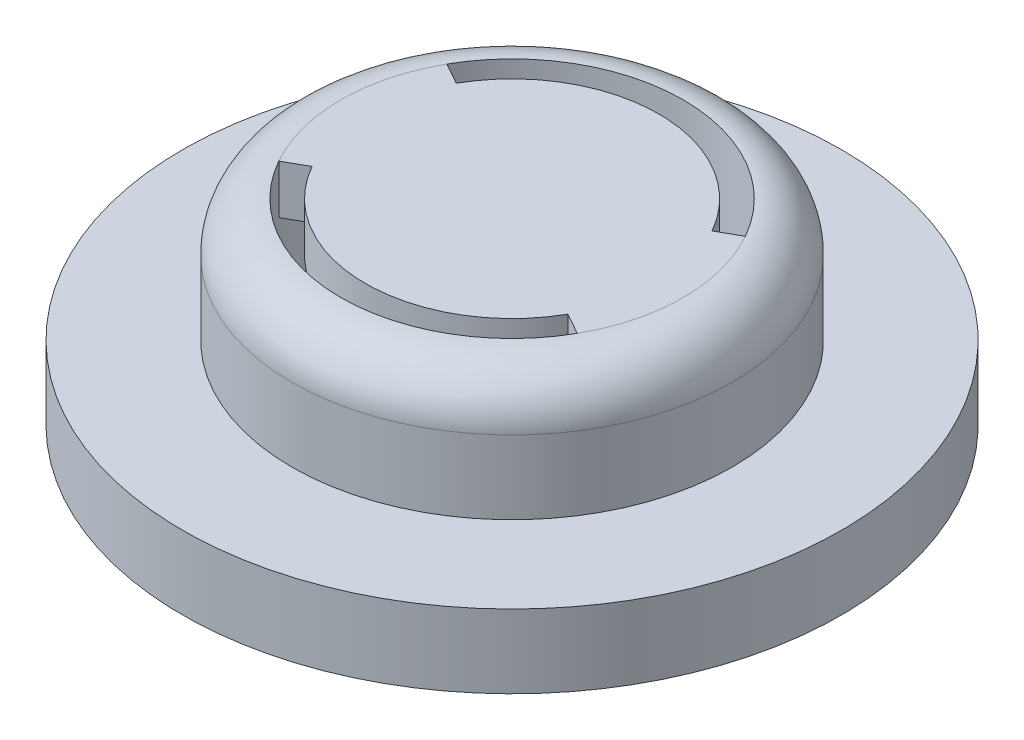
ISO-10303-21;
HEADER;
FILE_DESCRIPTION(('STEP AP214'),'2;1');
FILE_NAME('part.step','',(''),(''),'','','');
FILE_SCHEMA(('AUTOMOTIVE_DESIGN { 1 0 10303 214 1 1 1 1 }'));
ENDSEC;
DATA;
#1=APPLICATION_CONTEXT('core data for automotive mechanical design processes');
#2=APPLICATION_PROTOCOL_DEFINITION('international standard','automotive_design',2000,#1);
#3=PRODUCT_CONTEXT('',#1,'mechanical');
#4=PRODUCT('Part','Part','',(#3));
#5=PRODUCT_RELATED_PRODUCT_CATEGORY('part','',(#4));
#6=PRODUCT_DEFINITION_FORMATION('','',#4);
#7=PRODUCT_DEFINITION_CONTEXT('part definition',#1,'design');
#8=PRODUCT_DEFINITION('design','',#6,#7);
#9=PRODUCT_DEFINITION_SHAPE('','',#8);
#10=(LENGTH_UNIT() NAMED_UNIT(*) SI_UNIT(.MILLI.,.METRE.));
#11=(NAMED_UNIT(*) PLANE_ANGLE_UNIT() SI_UNIT($,.RADIAN.));
#12=(NAMED_UNIT(*) SI_UNIT($,.STERADIAN.) SOLID_ANGLE_UNIT());
#13=UNCERTAINTY_MEASURE_WITH_UNIT(LENGTH_MEASURE(1.E-05),#10,'distance_accuracy_value','');
#14=(GEOMETRIC_REPRESENTATION_CONTEXT(3) GLOBAL_UNCERTAINTY_ASSIGNED_CONTEXT((#13)) GLOBAL_UNIT_ASSIGNED_CONTEXT((#10,
#11,#12)) REPRESENTATION_CONTEXT('',''));
#15=CARTESIAN_POINT('',(0.,0.,0.));
#16=DIRECTION('',(0.,0.,1.));
#17=DIRECTION('',(1.,0.,0.));
#18=AXIS2_PLACEMENT_3D('',#15,#16,#17);
#19=CARTESIAN_POINT('',(0.,3.,0.));
#20=DIRECTION('',(0.,1.,0.));
#21=DIRECTION('',(0.,0.,1.));
#22=AXIS2_PLACEMENT_3D('',#19,#20,#21);
#23=TOROIDAL_SURFACE('',#22,7.,2.);
#24=CARTESIAN_POINT('',(0.,3.,0.));
#25=DIRECTION('',(0.,1.,0.));
#26=DIRECTION('',(0.,0.,1.));
#27=AXIS2_PLACEMENT_3D('',#24,#25,#26);
#28=CIRCLE('',#27,9.);
#29=CARTESIAN_POINT('',(0.,3.,9.));
#30=VERTEX_POINT('',#29);
#31=EDGE_CURVE('E187',#30,#30,#28,.F.);
#32=ORIENTED_EDGE('',*,*,#31,.F.);
#33=EDGE_LOOP('',(#32));
#34=FACE_BOUND('',#33,.T.);
#35=CARTESIAN_POINT('',(0.,5.,0.));
#36=DIRECTION('',(0.,1.,0.));
#37=DIRECTION('',(0.,0.,1.));
#38=AXIS2_PLACEMENT_3D('',#35,#36,#37);
#39=CIRCLE('',#38,7.);
#40=CARTESIAN_POINT('',(6.09888285533811,5.,3.43564083059666));
#41=VERTEX_POINT('',#40);
#42=CARTESIAN_POINT('',(6.09888285533811,5.,-3.43564083059665));
#43=VERTEX_POINT('',#42);
#44=EDGE_CURVE('E192',#41,#43,#39,.T.);
#45=ORIENTED_EDGE('',*,*,#44,.F.);
#46=CARTESIAN_POINT('',(0.,5.,0.));
#47=DIRECTION('',(0.,1.,0.));
#48=DIRECTION('',(0.,0.,1.));
#49=AXIS2_PLACEMENT_3D('',#46,#47,#48);
#50=CIRCLE('',#49,6.99999999999998);
#51=CARTESIAN_POINT('',(-6.09888285533803,5.,3.43564083059675));
#52=VERTEX_POINT('',#51);
#53=EDGE_CURVE('E129',#52,#41,#50,.T.);
#54=ORIENTED_EDGE('',*,*,#53,.F.);
#55=CARTESIAN_POINT('',(-6.09888285533813,5.,-3.43564083059658));
#56=VERTEX_POINT('',#55);
#57=EDGE_CURVE('E126',#56,#52,#39,.T.);
#58=ORIENTED_EDGE('',*,*,#57,.F.);
#59=CARTESIAN_POINT('',(0.,5.,0.));
#60=DIRECTION('',(0.,1.,0.));
#61=DIRECTION('',(0.,0.,1.));
#62=AXIS2_PLACEMENT_3D('',#59,#60,#61);
#63=CIRCLE('',#62,6.99999999999998);
#64=EDGE_CURVE('E149',#43,#56,#63,.T.);
#65=ORIENTED_EDGE('',*,*,#64,.F.);
#66=EDGE_LOOP('',(#45,#54,#58,#65));
#67=FACE_BOUND('',#66,.T.);
#68=ADVANCED_FACE('F41',(#34,#67),#23,.T.);
#69=CARTESIAN_POINT('',(0.,5.,0.));
#70=DIRECTION('',(0.,-1.,0.));
#71=DIRECTION('',(0.,0.,-1.));
#72=AXIS2_PLACEMENT_3D('',#69,#70,#71);
#73=CYLINDRICAL_SURFACE('',#72,9.);
#74=ORIENTED_EDGE('',*,*,#31,.T.);
#75=EDGE_LOOP('',(#74));
#76=FACE_BOUND('',#75,.T.);
#77=CARTESIAN_POINT('',(0.,0.,0.));
#78=DIRECTION('',(0.,1.,0.));
#79=DIRECTION('',(0.,0.,1.));
#80=AXIS2_PLACEMENT_3D('',#77,#78,#79);
#81=CIRCLE('',#80,9.);
#82=CARTESIAN_POINT('',(0.,0.,9.));
#83=VERTEX_POINT('',#82);
#84=EDGE_CURVE('E181',#83,#83,#81,.T.);
#85=ORIENTED_EDGE('',*,*,#84,.T.);
#86=EDGE_LOOP('',(#85));
#87=FACE_BOUND('',#86,.T.);
#88=ADVANCED_FACE('F214',(#76,#87),#73,.T.);
#89=CARTESIAN_POINT('',(0.,5.,0.));
#90=DIRECTION('',(0.,1.,0.));
#91=DIRECTION('',(0.,0.,1.));
#92=AXIS2_PLACEMENT_3D('',#89,#90,#91);
#93=PLANE('',#92);
#94=DIRECTION('',(-0.871268979334008,0.,0.490805832942393));
#95=VECTOR('',#94,1.);
#96=CARTESIAN_POINT('',(-5.227613876004,5.,2.94483499765435));
#97=LINE('',#96,#95);
#98=CARTESIAN_POINT('',(-5.227613876004,5.,2.94483499765435));
#99=VERTEX_POINT('',#98);
#100=EDGE_CURVE('E112',#99,#52,#97,.T.);
#101=ORIENTED_EDGE('',*,*,#100,.F.);
#102=CARTESIAN_POINT('',(0.,5.,0.));
#103=DIRECTION('',(0.,-1.,0.));
#104=DIRECTION('',(0.,0.,1.));
#105=AXIS2_PLACEMENT_3D('',#102,#103,#104);
#106=CIRCLE('',#105,5.99999999999998);
#107=CARTESIAN_POINT('',(5.22761387600408,5.,2.94483499765427));
#108=VERTEX_POINT('',#107);
#109=EDGE_CURVE('E120',#108,#99,#106,.T.);
#110=ORIENTED_EDGE('',*,*,#109,.F.);
#111=DIRECTION('',(-0.871268979334015,0.,-0.49080583294238));
#112=VECTOR('',#111,1.);
#113=CARTESIAN_POINT('',(5.22761387600409,5.,2.94483499765428));
#114=LINE('',#113,#112);
#115=EDGE_CURVE('E54',#41,#108,#114,.T.);
#116=ORIENTED_EDGE('',*,*,#115,.F.);
#117=ORIENTED_EDGE('',*,*,#44,.T.);
#118=DIRECTION('',(0.871268979334015,0.,-0.490805832942379));
#119=VECTOR('',#118,1.);
#120=CARTESIAN_POINT('',(5.22761387600409,5.,-2.94483499765428));
#121=LINE('',#120,#119);
#122=CARTESIAN_POINT('',(5.22761387600409,5.,-2.94483499765428));
#123=VERTEX_POINT('',#122);
#124=EDGE_CURVE('E155',#123,#43,#121,.T.);
#125=ORIENTED_EDGE('',*,*,#124,.F.);
#126=CARTESIAN_POINT('',(0.,5.,0.));
#127=DIRECTION('',(0.,-1.,0.));
#128=DIRECTION('',(0.,0.,1.));
#129=AXIS2_PLACEMENT_3D('',#126,#127,#128);
#130=CIRCLE('',#129,5.99999999999998);
#131=CARTESIAN_POINT('',(-5.2276138760041,5.,-2.94483499765421));
#132=VERTEX_POINT('',#131);
#133=EDGE_CURVE('E125',#132,#123,#130,.T.);
#134=ORIENTED_EDGE('',*,*,#133,.F.);
#135=DIRECTION('',(0.871268979334022,0.,0.490805832942367));
#136=VECTOR('',#135,1.);
#137=CARTESIAN_POINT('',(-5.22761387600409,5.,-2.9448349976542));
#138=LINE('',#137,#136);
#139=EDGE_CURVE('E62',#56,#132,#138,.T.);
#140=ORIENTED_EDGE('',*,*,#139,.F.);
#141=ORIENTED_EDGE('',*,*,#57,.T.);
#142=EDGE_LOOP('',(#101,#110,#116,#117,#125,#134,#140,#141));
#143=FACE_BOUND('',#142,.T.);
#144=ADVANCED_FACE('F127',(#143),#93,.T.);
#145=CARTESIAN_POINT('',(0.,-3.,0.));
#146=DIRECTION('',(0.,1.,0.));
#147=DIRECTION('',(0.,0.,1.));
#148=AXIS2_PLACEMENT_3D('',#145,#146,#147);
#149=CYLINDRICAL_SURFACE('',#148,13.4690289444197);
#150=CARTESIAN_POINT('',(0.,-3.,0.));
#151=DIRECTION('',(0.,-1.,0.));
#152=DIRECTION('',(0.,0.,-1.));
#153=AXIS2_PLACEMENT_3D('',#150,#151,#152);
#154=CIRCLE('',#153,13.4690289444197);
#155=CARTESIAN_POINT('',(0.,-3.,-13.4690289444197));
#156=VERTEX_POINT('',#155);
#157=EDGE_CURVE('E178',#156,#156,#154,.T.);
#158=ORIENTED_EDGE('',*,*,#157,.F.);
#159=EDGE_LOOP('',(#158));
#160=FACE_BOUND('',#159,.T.);
#161=CARTESIAN_POINT('',(0.,0.,0.));
#162=DIRECTION('',(0.,-1.,0.));
#163=DIRECTION('',(0.,0.,-1.));
#164=AXIS2_PLACEMENT_3D('',#161,#162,#163);
#165=CIRCLE('',#164,13.4690289444197);
#166=CARTESIAN_POINT('',(0.,0.,-13.4690289444197));
#167=VERTEX_POINT('',#166);
#168=EDGE_CURVE('E168',#167,#167,#165,.T.);
#169=ORIENTED_EDGE('',*,*,#168,.T.);
#170=EDGE_LOOP('',(#169));
#171=FACE_BOUND('',#170,.T.);
#172=ADVANCED_FACE('F235',(#160,#171),#149,.T.);
#173=CARTESIAN_POINT('',(0.,-3.,0.));
#174=DIRECTION('',(0.,-1.,0.));
#175=DIRECTION('',(0.,0.,-1.));
#176=AXIS2_PLACEMENT_3D('',#173,#174,#175);
#177=PLANE('',#176);
#178=CARTESIAN_POINT('',(0.,-3.,0.));
#179=DIRECTION('',(0.,-1.,0.));
#180=DIRECTION('',(0.,0.,-1.));
#181=AXIS2_PLACEMENT_3D('',#178,#179,#180);
#182=CIRCLE('',#181,11.4690289444197);
#183=CARTESIAN_POINT('',(0.,-3.,-11.4690289444197));
#184=VERTEX_POINT('',#183);
#185=EDGE_CURVE('E171',#184,#184,#182,.T.);
#186=ORIENTED_EDGE('',*,*,#185,.F.);
#187=EDGE_LOOP('',(#186));
#188=FACE_BOUND('',#187,.T.);
#189=ORIENTED_EDGE('',*,*,#157,.T.);
#190=EDGE_LOOP('',(#189));
#191=FACE_BOUND('',#190,.T.);
#192=ADVANCED_FACE('F230',(#188,#191),#177,.T.);
#193=CARTESIAN_POINT('',(0.,0.,0.));
#194=DIRECTION('',(0.,-1.,0.));
#195=DIRECTION('',(0.,0.,-1.));
#196=AXIS2_PLACEMENT_3D('',#193,#194,#195);
#197=PLANE('',#196);
#198=ORIENTED_EDGE('',*,*,#84,.F.);
#199=EDGE_LOOP('',(#198));
#200=FACE_BOUND('',#199,.T.);
#201=ORIENTED_EDGE('',*,*,#168,.F.);
#202=EDGE_LOOP('',(#201));
#203=FACE_BOUND('',#202,.T.);
#204=ADVANCED_FACE('F228',(#200,#203),#197,.F.);
#205=CARTESIAN_POINT('',(0.,5.,0.));
#206=DIRECTION('',(0.,-1.,0.));
#207=DIRECTION('',(0.,0.,-1.));
#208=AXIS2_PLACEMENT_3D('',#205,#206,#207);
#209=CYLINDRICAL_SURFACE('',#208,7.);
#210=CARTESIAN_POINT('',(0.,3.,0.));
#211=DIRECTION('',(0.,1.,0.));
#212=DIRECTION('',(0.,0.,1.));
#213=AXIS2_PLACEMENT_3D('',#210,#211,#212);
#214=CIRCLE('',#213,7.);
#215=CARTESIAN_POINT('',(-6.09888285533813,3.,-3.43564083059658));
#216=VERTEX_POINT('',#215);
#217=CARTESIAN_POINT('',(-6.09888285533805,3.,3.43564083059676));
#218=VERTEX_POINT('',#217);
#219=EDGE_CURVE('E173',#216,#218,#214,.T.);
#220=ORIENTED_EDGE('',*,*,#219,.T.);
#221=DIRECTION('',(0.,1.,0.));
#222=VECTOR('',#221,1.);
#223=CARTESIAN_POINT('',(-6.09888285533803,-8.,3.43564083059675));
#224=LINE('',#223,#222);
#225=EDGE_CURVE('E118',#218,#52,#224,.T.);
#226=ORIENTED_EDGE('',*,*,#225,.T.);
#227=ORIENTED_EDGE('',*,*,#53,.T.);
#228=DIRECTION('',(0.,1.,0.));
#229=VECTOR('',#228,1.);
#230=CARTESIAN_POINT('',(6.09888285533811,-8.,3.43564083059666));
#231=LINE('',#230,#229);
#232=CARTESIAN_POINT('',(6.09888285533811,3.,3.43564083059666));
#233=VERTEX_POINT('',#232);
#234=EDGE_CURVE('E139',#233,#41,#231,.T.);
#235=ORIENTED_EDGE('',*,*,#234,.F.);
#236=CARTESIAN_POINT('',(6.09888285533811,3.,-3.43564083059666));
#237=VERTEX_POINT('',#236);
#238=EDGE_CURVE('E170',#233,#237,#214,.T.);
#239=ORIENTED_EDGE('',*,*,#238,.T.);
#240=DIRECTION('',(0.,1.,0.));
#241=VECTOR('',#240,1.);
#242=CARTESIAN_POINT('',(6.09888285533811,-8.,-3.43564083059665));
#243=LINE('',#242,#241);
#244=EDGE_CURVE('E142',#237,#43,#243,.T.);
#245=ORIENTED_EDGE('',*,*,#244,.T.);
#246=ORIENTED_EDGE('',*,*,#64,.T.);
#247=DIRECTION('',(0.,1.,0.));
#248=VECTOR('',#247,1.);
#249=CARTESIAN_POINT('',(-6.09888285533813,-8.,-3.43564083059658));
#250=LINE('',#249,#248);
#251=EDGE_CURVE('E145',#216,#56,#250,.T.);
#252=ORIENTED_EDGE('',*,*,#251,.F.);
#253=EDGE_LOOP('',(#220,#226,#227,#235,#239,#245,#246,#252));
#254=FACE_BOUND('',#253,.T.);
#255=CARTESIAN_POINT('',(0.,-2.,0.));
#256=DIRECTION('',(0.,-1.,0.));
#257=DIRECTION('',(0.,0.,-1.));
#258=AXIS2_PLACEMENT_3D('',#255,#256,#257);
#259=CIRCLE('',#258,7.);
#260=CARTESIAN_POINT('',(0.,-2.,-7.));
#261=VERTEX_POINT('',#260);
#262=EDGE_CURVE('E174',#261,#261,#259,.F.);
#263=ORIENTED_EDGE('',*,*,#262,.F.);
#264=EDGE_LOOP('',(#263));
#265=FACE_BOUND('',#264,.T.);
#266=ADVANCED_FACE('F206',(#254,#265),#209,.F.);
#267=CARTESIAN_POINT('',(0.,3.,0.));
#268=DIRECTION('',(0.,1.,0.));
#269=DIRECTION('',(0.,0.,1.));
#270=AXIS2_PLACEMENT_3D('',#267,#268,#269);
#271=PLANE('',#270);
#272=ORIENTED_EDGE('',*,*,#238,.F.);
#273=DIRECTION('',(-0.871268979334015,0.,-0.49080583294238));
#274=VECTOR('',#273,1.);
#275=CARTESIAN_POINT('',(0.,3.,0.));
#276=LINE('',#275,#274);
#277=CARTESIAN_POINT('',(5.22761387600409,3.,2.94483499765428));
#278=VERTEX_POINT('',#277);
#279=EDGE_CURVE('E162',#233,#278,#276,.T.);
#280=ORIENTED_EDGE('',*,*,#279,.T.);
#281=CARTESIAN_POINT('',(0.,3.,0.));
#282=DIRECTION('',(0.,1.,0.));
#283=DIRECTION('',(0.,0.,1.));
#284=AXIS2_PLACEMENT_3D('',#281,#282,#283);
#285=CIRCLE('',#284,5.99999999999998);
#286=CARTESIAN_POINT('',(-5.227613876004,3.,2.94483499765435));
#287=VERTEX_POINT('',#286);
#288=EDGE_CURVE('E11',#278,#287,#285,.F.);
#289=ORIENTED_EDGE('',*,*,#288,.T.);
#290=DIRECTION('',(-0.871268979334008,0.,0.490805832942393));
#291=VECTOR('',#290,1.);
#292=CARTESIAN_POINT('',(0.,3.,0.));
#293=LINE('',#292,#291);
#294=EDGE_CURVE('E111',#287,#218,#293,.T.);
#295=ORIENTED_EDGE('',*,*,#294,.T.);
#296=ORIENTED_EDGE('',*,*,#219,.F.);
#297=DIRECTION('',(0.871268979334022,0.,0.490805832942367));
#298=VECTOR('',#297,1.);
#299=CARTESIAN_POINT('',(0.,3.,0.));
#300=LINE('',#299,#298);
#301=CARTESIAN_POINT('',(-5.22761387600409,3.,-2.9448349976542));
#302=VERTEX_POINT('',#301);
#303=EDGE_CURVE('E157',#216,#302,#300,.T.);
#304=ORIENTED_EDGE('',*,*,#303,.T.);
#305=CARTESIAN_POINT('',(0.,3.,0.));
#306=DIRECTION('',(0.,1.,0.));
#307=DIRECTION('',(0.,0.,1.));
#308=AXIS2_PLACEMENT_3D('',#305,#306,#307);
#309=CIRCLE('',#308,5.99999999999998);
#310=CARTESIAN_POINT('',(5.22761387600409,3.,-2.94483499765428));
#311=VERTEX_POINT('',#310);
#312=EDGE_CURVE('E48',#302,#311,#309,.F.);
#313=ORIENTED_EDGE('',*,*,#312,.T.);
#314=DIRECTION('',(0.871268979334016,0.,-0.490805832942379));
#315=VECTOR('',#314,1.);
#316=CARTESIAN_POINT('',(0.,3.,0.));
#317=LINE('',#316,#315);
#318=EDGE_CURVE('E137',#311,#237,#317,.T.);
#319=ORIENTED_EDGE('',*,*,#318,.T.);
#320=EDGE_LOOP('',(#272,#280,#289,#295,#296,#304,#313,#319));
#321=FACE_BOUND('',#320,.T.);
#322=ADVANCED_FACE('F198',(#321),#271,.F.);
#323=CARTESIAN_POINT('',(0.,-3.,0.));
#324=DIRECTION('',(0.,1.,0.));
#325=DIRECTION('',(0.,0.,1.));
#326=AXIS2_PLACEMENT_3D('',#323,#324,#325);
#327=CYLINDRICAL_SURFACE('',#326,11.4690289444197);
#328=ORIENTED_EDGE('',*,*,#185,.T.);
#329=EDGE_LOOP('',(#328));
#330=FACE_BOUND('',#329,.T.);
#331=CARTESIAN_POINT('',(0.,-2.,0.));
#332=DIRECTION('',(0.,-1.,0.));
#333=DIRECTION('',(0.,0.,-1.));
#334=AXIS2_PLACEMENT_3D('',#331,#332,#333);
#335=CIRCLE('',#334,11.4690289444197);
#336=CARTESIAN_POINT('',(0.,-2.,-11.4690289444197));
#337=VERTEX_POINT('',#336);
#338=EDGE_CURVE('E167',#337,#337,#335,.T.);
#339=ORIENTED_EDGE('',*,*,#338,.F.);
#340=EDGE_LOOP('',(#339));
#341=FACE_BOUND('',#340,.T.);
#342=ADVANCED_FACE('F250',(#330,#341),#327,.F.);
#343=CARTESIAN_POINT('',(0.,-2.,0.));
#344=DIRECTION('',(0.,-1.,0.));
#345=DIRECTION('',(0.,0.,-1.));
#346=AXIS2_PLACEMENT_3D('',#343,#344,#345);
#347=PLANE('',#346);
#348=ORIENTED_EDGE('',*,*,#262,.T.);
#349=EDGE_LOOP('',(#348));
#350=FACE_BOUND('',#349,.T.);
#351=ORIENTED_EDGE('',*,*,#338,.T.);
#352=EDGE_LOOP('',(#351));
#353=FACE_BOUND('',#352,.T.);
#354=ADVANCED_FACE('F241',(#350,#353),#347,.T.);
#355=CARTESIAN_POINT('',(0.,-8.,0.));
#356=DIRECTION('',(0.,1.,0.));
#357=DIRECTION('',(0.,0.,1.));
#358=AXIS2_PLACEMENT_3D('',#355,#356,#357);
#359=CYLINDRICAL_SURFACE('',#358,5.99999999999998);
#360=DIRECTION('',(0.,1.,0.));
#361=VECTOR('',#360,1.);
#362=CARTESIAN_POINT('',(-5.22761387600409,-8.,-2.9448349976542));
#363=LINE('',#362,#361);
#364=EDGE_CURVE('E148',#302,#132,#363,.T.);
#365=ORIENTED_EDGE('',*,*,#364,.T.);
#366=ORIENTED_EDGE('',*,*,#133,.T.);
#367=DIRECTION('',(0.,1.,0.));
#368=VECTOR('',#367,1.);
#369=CARTESIAN_POINT('',(5.22761387600409,-8.,-2.94483499765428));
#370=LINE('',#369,#368);
#371=EDGE_CURVE('E138',#311,#123,#370,.T.);
#372=ORIENTED_EDGE('',*,*,#371,.F.);
#373=ORIENTED_EDGE('',*,*,#312,.F.);
#374=EDGE_LOOP('',(#365,#366,#372,#373));
#375=FACE_BOUND('',#374,.T.);
#376=ADVANCED_FACE('F199',(#375),#359,.T.);
#377=CARTESIAN_POINT('',(-5.22761387600409,-8.,-2.9448349976542));
#378=DIRECTION('',(-0.490805832942367,0.,0.871268979334022));
#379=DIRECTION('',(0.871268979334022,0.,0.490805832942367));
#380=AXIS2_PLACEMENT_3D('',#377,#378,#379);
#381=PLANE('',#380);
#382=ORIENTED_EDGE('',*,*,#251,.T.);
#383=ORIENTED_EDGE('',*,*,#139,.T.);
#384=ORIENTED_EDGE('',*,*,#364,.F.);
#385=ORIENTED_EDGE('',*,*,#303,.F.);
#386=EDGE_LOOP('',(#382,#383,#384,#385));
#387=FACE_BOUND('',#386,.T.);
#388=ADVANCED_FACE('F205',(#387),#381,.F.);
#389=CARTESIAN_POINT('',(5.22761387600409,-8.,-2.94483499765428));
#390=DIRECTION('',(0.490805832942379,0.,0.871268979334015));
#391=DIRECTION('',(0.871268979334016,0.,-0.490805832942379));
#392=AXIS2_PLACEMENT_3D('',#389,#390,#391);
#393=PLANE('',#392);
#394=ORIENTED_EDGE('',*,*,#371,.T.);
#395=ORIENTED_EDGE('',*,*,#124,.T.);
#396=ORIENTED_EDGE('',*,*,#244,.F.);
#397=ORIENTED_EDGE('',*,*,#318,.F.);
#398=EDGE_LOOP('',(#394,#395,#396,#397));
#399=FACE_BOUND('',#398,.T.);
#400=ADVANCED_FACE('F259',(#399),#393,.F.);
#401=CARTESIAN_POINT('',(0.,-8.,0.));
#402=DIRECTION('',(0.,1.,0.));
#403=DIRECTION('',(0.,0.,1.));
#404=AXIS2_PLACEMENT_3D('',#401,#402,#403);
#405=CYLINDRICAL_SURFACE('',#404,5.99999999999998);
#406=DIRECTION('',(0.,1.,0.));
#407=VECTOR('',#406,1.);
#408=CARTESIAN_POINT('',(5.22761387600409,-8.,2.94483499765428));
#409=LINE('',#408,#407);
#410=EDGE_CURVE('E122',#278,#108,#409,.T.);
#411=ORIENTED_EDGE('',*,*,#410,.T.);
#412=ORIENTED_EDGE('',*,*,#109,.T.);
#413=DIRECTION('',(0.,1.,0.));
#414=VECTOR('',#413,1.);
#415=CARTESIAN_POINT('',(-5.227613876004,-8.,2.94483499765435));
#416=LINE('',#415,#414);
#417=EDGE_CURVE('E110',#287,#99,#416,.T.);
#418=ORIENTED_EDGE('',*,*,#417,.F.);
#419=ORIENTED_EDGE('',*,*,#288,.F.);
#420=EDGE_LOOP('',(#411,#412,#418,#419));
#421=FACE_BOUND('',#420,.T.);
#422=ADVANCED_FACE('F116',(#421),#405,.T.);
#423=CARTESIAN_POINT('',(5.22761387600409,-8.,2.94483499765428));
#424=DIRECTION('',(0.49080583294238,0.,-0.871268979334015));
#425=DIRECTION('',(-0.871268979334015,0.,-0.49080583294238));
#426=AXIS2_PLACEMENT_3D('',#423,#424,#425);
#427=PLANE('',#426);
#428=ORIENTED_EDGE('',*,*,#234,.T.);
#429=ORIENTED_EDGE('',*,*,#115,.T.);
#430=ORIENTED_EDGE('',*,*,#410,.F.);
#431=ORIENTED_EDGE('',*,*,#279,.F.);
#432=EDGE_LOOP('',(#428,#429,#430,#431));
#433=FACE_BOUND('',#432,.T.);
#434=ADVANCED_FACE('F207',(#433),#427,.F.);
#435=CARTESIAN_POINT('',(-5.227613876004,-8.,2.94483499765435));
#436=DIRECTION('',(-0.490805832942393,0.,-0.871268979334008));
#437=DIRECTION('',(-0.871268979334008,0.,0.490805832942393));
#438=AXIS2_PLACEMENT_3D('',#435,#436,#437);
#439=PLANE('',#438);
#440=ORIENTED_EDGE('',*,*,#417,.T.);
#441=ORIENTED_EDGE('',*,*,#100,.T.);
#442=ORIENTED_EDGE('',*,*,#225,.F.);
#443=ORIENTED_EDGE('',*,*,#294,.F.);
#444=EDGE_LOOP('',(#440,#441,#442,#443));
#445=FACE_BOUND('',#444,.T.);
#446=ADVANCED_FACE('F108',(#445),#439,.F.);
#447=CLOSED_SHELL('',(#68,#88,#144,#172,#192,#204,#266,#322,#342,#354,#376,#388,#400,#422,#434,#446));
#448=MANIFOLD_SOLID_BREP('B2',#447);
#449=ADVANCED_BREP_SHAPE_REPRESENTATION('',(#18,#448),#14);
#450=SHAPE_DEFINITION_REPRESENTATION(#9,#449);
ENDSEC;
END-ISO-10303-21;
